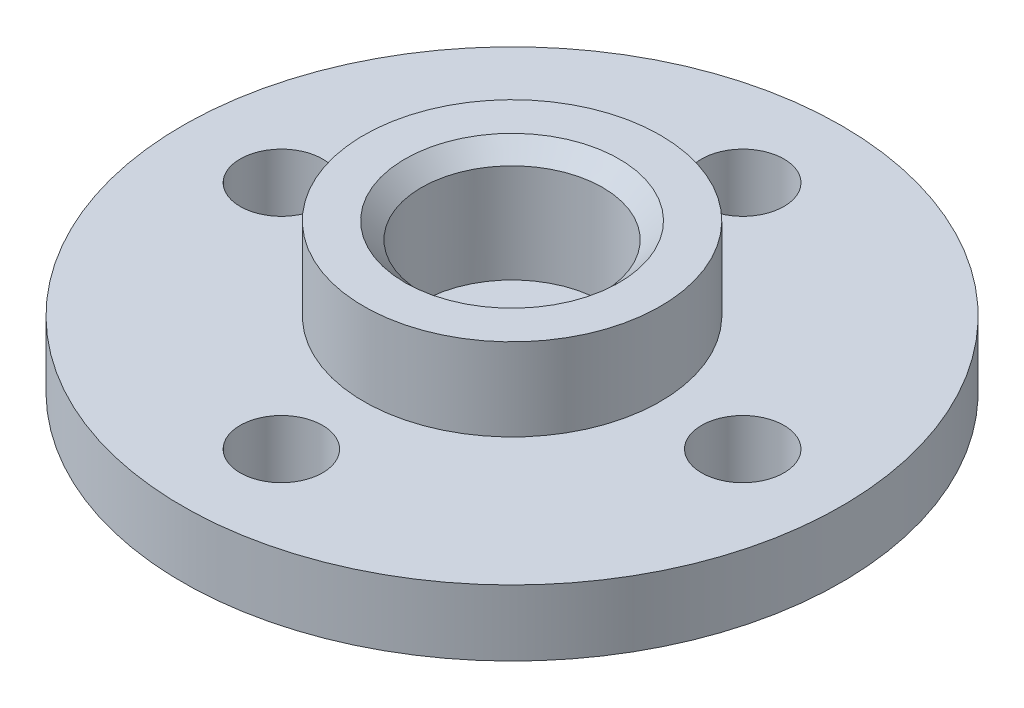
ISO-10303-21;
HEADER;
FILE_DESCRIPTION(('STEP AP214'),'2;1');
FILE_NAME('part.step','',(''),(''),'','','');
FILE_SCHEMA(('AUTOMOTIVE_DESIGN { 1 0 10303 214 1 1 1 1 }'));
ENDSEC;
DATA;
#1=APPLICATION_CONTEXT('core data for automotive mechanical design processes');
#2=APPLICATION_PROTOCOL_DEFINITION('international standard','automotive_design',2000,#1);
#3=PRODUCT_CONTEXT('',#1,'mechanical');
#4=PRODUCT('Part','Part','',(#3));
#5=PRODUCT_RELATED_PRODUCT_CATEGORY('part','',(#4));
#6=PRODUCT_DEFINITION_FORMATION('','',#4);
#7=PRODUCT_DEFINITION_CONTEXT('part definition',#1,'design');
#8=PRODUCT_DEFINITION('design','',#6,#7);
#9=PRODUCT_DEFINITION_SHAPE('','',#8);
#10=(LENGTH_UNIT() NAMED_UNIT(*) SI_UNIT(.MILLI.,.METRE.));
#11=(NAMED_UNIT(*) PLANE_ANGLE_UNIT() SI_UNIT($,.RADIAN.));
#12=(NAMED_UNIT(*) SI_UNIT($,.STERADIAN.) SOLID_ANGLE_UNIT());
#13=UNCERTAINTY_MEASURE_WITH_UNIT(LENGTH_MEASURE(1.E-05),#10,'distance_accuracy_value','');
#14=(GEOMETRIC_REPRESENTATION_CONTEXT(3) GLOBAL_UNCERTAINTY_ASSIGNED_CONTEXT((#13)) GLOBAL_UNIT_ASSIGNED_CONTEXT((#10,
#11,#12)) REPRESENTATION_CONTEXT('',''));
#15=CARTESIAN_POINT('',(0.,0.,0.));
#16=DIRECTION('',(0.,0.,1.));
#17=DIRECTION('',(1.,0.,0.));
#18=AXIS2_PLACEMENT_3D('',#15,#16,#17);
#19=CARTESIAN_POINT('',(0.,0.,0.));
#20=DIRECTION('',(0.,-1.,0.));
#21=DIRECTION('',(0.,0.,-1.));
#22=AXIS2_PLACEMENT_3D('',#19,#20,#21);
#23=CYLINDRICAL_SURFACE('',#22,1.);
#24=CARTESIAN_POINT('',(0.,0.,0.));
#25=DIRECTION('',(0.,-1.,0.));
#26=DIRECTION('',(0.,0.,-1.));
#27=AXIS2_PLACEMENT_3D('',#24,#25,#26);
#28=CIRCLE('',#27,1.);
#29=CARTESIAN_POINT('',(0.,0.,-1.));
#30=VERTEX_POINT('',#29);
#31=EDGE_CURVE('E46',#30,#30,#28,.T.);
#32=ORIENTED_EDGE('',*,*,#31,.T.);
#33=EDGE_LOOP('',(#32));
#34=FACE_BOUND('',#33,.T.);
#35=CARTESIAN_POINT('',(0.,1.,0.));
#36=DIRECTION('',(0.,-1.,0.));
#37=DIRECTION('',(0.,0.,-1.));
#38=AXIS2_PLACEMENT_3D('',#35,#36,#37);
#39=CIRCLE('',#38,1.);
#40=CARTESIAN_POINT('',(0.,1.,-1.));
#41=VERTEX_POINT('',#40);
#42=EDGE_CURVE('E67',#41,#41,#39,.T.);
#43=ORIENTED_EDGE('',*,*,#42,.F.);
#44=EDGE_LOOP('',(#43));
#45=FACE_BOUND('',#44,.T.);
#46=ADVANCED_FACE('F34',(#34,#45),#23,.F.);
#47=CARTESIAN_POINT('',(0.,0.,-2.75));
#48=DIRECTION('',(0.,-1.,0.));
#49=DIRECTION('',(0.,0.,-1.));
#50=AXIS2_PLACEMENT_3D('',#47,#48,#49);
#51=PLANE('',#50);
#52=CARTESIAN_POINT('',(0.,0.,-7.));
#53=DIRECTION('',(0.,1.,0.));
#54=DIRECTION('',(0.,0.,1.));
#55=AXIS2_PLACEMENT_3D('',#52,#53,#54);
#56=CIRCLE('',#55,1.25);
#57=CARTESIAN_POINT('',(0.,0.,-5.75));
#58=VERTEX_POINT('',#57);
#59=EDGE_CURVE('E88',#58,#58,#56,.T.);
#60=ORIENTED_EDGE('',*,*,#59,.T.);
#61=EDGE_LOOP('',(#60));
#62=FACE_BOUND('',#61,.T.);
#63=CARTESIAN_POINT('',(-7.,0.,0.));
#64=DIRECTION('',(0.,1.,0.));
#65=DIRECTION('',(0.,0.,1.));
#66=AXIS2_PLACEMENT_3D('',#63,#64,#65);
#67=CIRCLE('',#66,1.25);
#68=CARTESIAN_POINT('',(-7.,0.,1.25));
#69=VERTEX_POINT('',#68);
#70=EDGE_CURVE('E82',#69,#69,#67,.T.);
#71=ORIENTED_EDGE('',*,*,#70,.T.);
#72=EDGE_LOOP('',(#71));
#73=FACE_BOUND('',#72,.T.);
#74=CARTESIAN_POINT('',(7.,0.,0.));
#75=DIRECTION('',(0.,1.,0.));
#76=DIRECTION('',(0.,0.,1.));
#77=AXIS2_PLACEMENT_3D('',#74,#75,#76);
#78=CIRCLE('',#77,1.25);
#79=CARTESIAN_POINT('',(7.,0.,1.25));
#80=VERTEX_POINT('',#79);
#81=EDGE_CURVE('E76',#80,#80,#78,.T.);
#82=ORIENTED_EDGE('',*,*,#81,.T.);
#83=EDGE_LOOP('',(#82));
#84=FACE_BOUND('',#83,.T.);
#85=CARTESIAN_POINT('',(0.,0.,7.));
#86=DIRECTION('',(0.,1.,0.));
#87=DIRECTION('',(0.,0.,1.));
#88=AXIS2_PLACEMENT_3D('',#85,#86,#87);
#89=CIRCLE('',#88,1.25);
#90=CARTESIAN_POINT('',(0.,0.,8.25));
#91=VERTEX_POINT('',#90);
#92=EDGE_CURVE('E70',#91,#91,#89,.T.);
#93=ORIENTED_EDGE('',*,*,#92,.T.);
#94=EDGE_LOOP('',(#93));
#95=FACE_BOUND('',#94,.T.);
#96=CARTESIAN_POINT('',(0.,0.,0.));
#97=DIRECTION('',(0.,-1.,0.));
#98=DIRECTION('',(0.,0.,-1.));
#99=AXIS2_PLACEMENT_3D('',#96,#97,#98);
#100=CIRCLE('',#99,10.);
#101=CARTESIAN_POINT('',(0.,0.,-10.));
#102=VERTEX_POINT('',#101);
#103=EDGE_CURVE('E50',#102,#102,#100,.T.);
#104=ORIENTED_EDGE('',*,*,#103,.T.);
#105=EDGE_LOOP('',(#104));
#106=FACE_BOUND('',#105,.T.);
#107=ORIENTED_EDGE('',*,*,#31,.F.);
#108=EDGE_LOOP('',(#107));
#109=FACE_BOUND('',#108,.T.);
#110=ADVANCED_FACE('F115',(#62,#73,#84,#95,#106,#109),#51,.T.);
#111=CARTESIAN_POINT('',(0.,0.,0.));
#112=DIRECTION('',(0.,-1.,0.));
#113=DIRECTION('',(0.,0.,-1.));
#114=AXIS2_PLACEMENT_3D('',#111,#112,#113);
#115=CYLINDRICAL_SURFACE('',#114,10.);
#116=CARTESIAN_POINT('',(0.,2.,0.));
#117=DIRECTION('',(0.,-1.,0.));
#118=DIRECTION('',(0.,0.,-1.));
#119=AXIS2_PLACEMENT_3D('',#116,#117,#118);
#120=CIRCLE('',#119,10.);
#121=CARTESIAN_POINT('',(0.,2.,-10.));
#122=VERTEX_POINT('',#121);
#123=EDGE_CURVE('E55',#122,#122,#120,.T.);
#124=ORIENTED_EDGE('',*,*,#123,.T.);
#125=EDGE_LOOP('',(#124));
#126=FACE_BOUND('',#125,.T.);
#127=ORIENTED_EDGE('',*,*,#103,.F.);
#128=EDGE_LOOP('',(#127));
#129=FACE_BOUND('',#128,.T.);
#130=ADVANCED_FACE('F101',(#126,#129),#115,.T.);
#131=CARTESIAN_POINT('',(0.,2.,-10.));
#132=DIRECTION('',(0.,1.,0.));
#133=DIRECTION('',(0.,0.,1.));
#134=AXIS2_PLACEMENT_3D('',#131,#132,#133);
#135=PLANE('',#134);
#136=CARTESIAN_POINT('',(0.,2.,-7.));
#137=DIRECTION('',(0.,1.,0.));
#138=DIRECTION('',(0.,0.,1.));
#139=AXIS2_PLACEMENT_3D('',#136,#137,#138);
#140=CIRCLE('',#139,1.25);
#141=CARTESIAN_POINT('',(0.,2.,-5.75));
#142=VERTEX_POINT('',#141);
#143=EDGE_CURVE('E91',#142,#142,#140,.T.);
#144=ORIENTED_EDGE('',*,*,#143,.F.);
#145=EDGE_LOOP('',(#144));
#146=FACE_BOUND('',#145,.T.);
#147=CARTESIAN_POINT('',(-7.,2.,0.));
#148=DIRECTION('',(0.,1.,0.));
#149=DIRECTION('',(0.,0.,1.));
#150=AXIS2_PLACEMENT_3D('',#147,#148,#149);
#151=CIRCLE('',#150,1.25);
#152=CARTESIAN_POINT('',(-7.,2.,1.25));
#153=VERTEX_POINT('',#152);
#154=EDGE_CURVE('E85',#153,#153,#151,.T.);
#155=ORIENTED_EDGE('',*,*,#154,.F.);
#156=EDGE_LOOP('',(#155));
#157=FACE_BOUND('',#156,.T.);
#158=CARTESIAN_POINT('',(7.,2.,0.));
#159=DIRECTION('',(0.,1.,0.));
#160=DIRECTION('',(0.,0.,1.));
#161=AXIS2_PLACEMENT_3D('',#158,#159,#160);
#162=CIRCLE('',#161,1.25);
#163=CARTESIAN_POINT('',(7.,2.,1.25));
#164=VERTEX_POINT('',#163);
#165=EDGE_CURVE('E79',#164,#164,#162,.T.);
#166=ORIENTED_EDGE('',*,*,#165,.F.);
#167=EDGE_LOOP('',(#166));
#168=FACE_BOUND('',#167,.T.);
#169=CARTESIAN_POINT('',(0.,2.,7.));
#170=DIRECTION('',(0.,1.,0.));
#171=DIRECTION('',(0.,0.,1.));
#172=AXIS2_PLACEMENT_3D('',#169,#170,#171);
#173=CIRCLE('',#172,1.25);
#174=CARTESIAN_POINT('',(0.,2.,8.25));
#175=VERTEX_POINT('',#174);
#176=EDGE_CURVE('E73',#175,#175,#173,.T.);
#177=ORIENTED_EDGE('',*,*,#176,.F.);
#178=EDGE_LOOP('',(#177));
#179=FACE_BOUND('',#178,.T.);
#180=CARTESIAN_POINT('',(0.,2.,0.));
#181=DIRECTION('',(0.,-1.,0.));
#182=DIRECTION('',(0.,0.,-1.));
#183=AXIS2_PLACEMENT_3D('',#180,#181,#182);
#184=CIRCLE('',#183,4.5);
#185=CARTESIAN_POINT('',(0.,2.,-4.5));
#186=VERTEX_POINT('',#185);
#187=EDGE_CURVE('E58',#186,#186,#184,.T.);
#188=ORIENTED_EDGE('',*,*,#187,.T.);
#189=EDGE_LOOP('',(#188));
#190=FACE_BOUND('',#189,.T.);
#191=ORIENTED_EDGE('',*,*,#123,.F.);
#192=EDGE_LOOP('',(#191));
#193=FACE_BOUND('',#192,.T.);
#194=ADVANCED_FACE('F97',(#146,#157,#168,#179,#190,#193),#135,.T.);
#195=CARTESIAN_POINT('',(0.,0.,0.));
#196=DIRECTION('',(0.,-1.,0.));
#197=DIRECTION('',(0.,0.,-1.));
#198=AXIS2_PLACEMENT_3D('',#195,#196,#197);
#199=CYLINDRICAL_SURFACE('',#198,4.5);
#200=CARTESIAN_POINT('',(0.,4.5,0.));
#201=DIRECTION('',(0.,-1.,0.));
#202=DIRECTION('',(0.,0.,-1.));
#203=AXIS2_PLACEMENT_3D('',#200,#201,#202);
#204=CIRCLE('',#203,4.5);
#205=CARTESIAN_POINT('',(0.,4.5,-4.5));
#206=VERTEX_POINT('',#205);
#207=EDGE_CURVE('E61',#206,#206,#204,.T.);
#208=ORIENTED_EDGE('',*,*,#207,.T.);
#209=EDGE_LOOP('',(#208));
#210=FACE_BOUND('',#209,.T.);
#211=ORIENTED_EDGE('',*,*,#187,.F.);
#212=EDGE_LOOP('',(#211));
#213=FACE_BOUND('',#212,.T.);
#214=ADVANCED_FACE('F100',(#210,#213),#199,.T.);
#215=CARTESIAN_POINT('',(0.,4.5,-4.5));
#216=DIRECTION('',(0.,1.,0.));
#217=DIRECTION('',(0.,0.,1.));
#218=AXIS2_PLACEMENT_3D('',#215,#216,#217);
#219=PLANE('',#218);
#220=CARTESIAN_POINT('',(0.,4.5,0.));
#221=DIRECTION('',(0.,1.,0.));
#222=DIRECTION('',(0.,0.,1.));
#223=AXIS2_PLACEMENT_3D('',#220,#221,#222);
#224=CIRCLE('',#223,3.25);
#225=CARTESIAN_POINT('',(0.,4.5,3.25));
#226=VERTEX_POINT('',#225);
#227=EDGE_CURVE('E42',#226,#226,#224,.F.);
#228=ORIENTED_EDGE('',*,*,#227,.T.);
#229=EDGE_LOOP('',(#228));
#230=FACE_BOUND('',#229,.T.);
#231=ORIENTED_EDGE('',*,*,#207,.F.);
#232=EDGE_LOOP('',(#231));
#233=FACE_BOUND('',#232,.T.);
#234=ADVANCED_FACE('F138',(#230,#233),#219,.T.);
#235=CARTESIAN_POINT('',(0.,0.,0.));
#236=DIRECTION('',(0.,-1.,0.));
#237=DIRECTION('',(0.,0.,-1.));
#238=AXIS2_PLACEMENT_3D('',#235,#236,#237);
#239=CYLINDRICAL_SURFACE('',#238,2.75);
#240=CARTESIAN_POINT('',(0.,4.,0.));
#241=DIRECTION('',(0.,1.,0.));
#242=DIRECTION('',(0.,0.,1.));
#243=AXIS2_PLACEMENT_3D('',#240,#241,#242);
#244=CIRCLE('',#243,2.75);
#245=CARTESIAN_POINT('',(0.,4.,2.75));
#246=VERTEX_POINT('',#245);
#247=EDGE_CURVE('E10',#246,#246,#244,.T.);
#248=ORIENTED_EDGE('',*,*,#247,.T.);
#249=EDGE_LOOP('',(#248));
#250=FACE_BOUND('',#249,.T.);
#251=CARTESIAN_POINT('',(0.,1.,0.));
#252=DIRECTION('',(0.,-1.,0.));
#253=DIRECTION('',(0.,0.,-1.));
#254=AXIS2_PLACEMENT_3D('',#251,#252,#253);
#255=CIRCLE('',#254,2.75);
#256=CARTESIAN_POINT('',(0.,1.,-2.75));
#257=VERTEX_POINT('',#256);
#258=EDGE_CURVE('E64',#257,#257,#255,.T.);
#259=ORIENTED_EDGE('',*,*,#258,.T.);
#260=EDGE_LOOP('',(#259));
#261=FACE_BOUND('',#260,.T.);
#262=ADVANCED_FACE('F133',(#250,#261),#239,.F.);
#263=CARTESIAN_POINT('',(0.,1.,-2.75));
#264=DIRECTION('',(0.,1.,0.));
#265=DIRECTION('',(0.,0.,1.));
#266=AXIS2_PLACEMENT_3D('',#263,#264,#265);
#267=PLANE('',#266);
#268=ORIENTED_EDGE('',*,*,#42,.T.);
#269=EDGE_LOOP('',(#268));
#270=FACE_BOUND('',#269,.T.);
#271=ORIENTED_EDGE('',*,*,#258,.F.);
#272=EDGE_LOOP('',(#271));
#273=FACE_BOUND('',#272,.T.);
#274=ADVANCED_FACE('F129',(#270,#273),#267,.T.);
#275=CARTESIAN_POINT('',(0.,2.,7.));
#276=DIRECTION('',(0.,1.,0.));
#277=DIRECTION('',(0.,0.,1.));
#278=AXIS2_PLACEMENT_3D('',#275,#276,#277);
#279=CYLINDRICAL_SURFACE('',#278,1.25);
#280=ORIENTED_EDGE('',*,*,#92,.F.);
#281=EDGE_LOOP('',(#280));
#282=FACE_BOUND('',#281,.T.);
#283=ORIENTED_EDGE('',*,*,#176,.T.);
#284=EDGE_LOOP('',(#283));
#285=FACE_BOUND('',#284,.T.);
#286=ADVANCED_FACE('F132',(#282,#285),#279,.F.);
#287=CARTESIAN_POINT('',(7.,2.,0.));
#288=DIRECTION('',(0.,1.,0.));
#289=DIRECTION('',(0.,0.,1.));
#290=AXIS2_PLACEMENT_3D('',#287,#288,#289);
#291=CYLINDRICAL_SURFACE('',#290,1.25);
#292=ORIENTED_EDGE('',*,*,#81,.F.);
#293=EDGE_LOOP('',(#292));
#294=FACE_BOUND('',#293,.T.);
#295=ORIENTED_EDGE('',*,*,#165,.T.);
#296=EDGE_LOOP('',(#295));
#297=FACE_BOUND('',#296,.T.);
#298=ADVANCED_FACE('F190',(#294,#297),#291,.F.);
#299=CARTESIAN_POINT('',(-7.,2.,0.));
#300=DIRECTION('',(0.,1.,0.));
#301=DIRECTION('',(0.,0.,1.));
#302=AXIS2_PLACEMENT_3D('',#299,#300,#301);
#303=CYLINDRICAL_SURFACE('',#302,1.25);
#304=ORIENTED_EDGE('',*,*,#70,.F.);
#305=EDGE_LOOP('',(#304));
#306=FACE_BOUND('',#305,.T.);
#307=ORIENTED_EDGE('',*,*,#154,.T.);
#308=EDGE_LOOP('',(#307));
#309=FACE_BOUND('',#308,.T.);
#310=ADVANCED_FACE('F185',(#306,#309),#303,.F.);
#311=CARTESIAN_POINT('',(0.,2.,-7.));
#312=DIRECTION('',(0.,1.,0.));
#313=DIRECTION('',(0.,0.,1.));
#314=AXIS2_PLACEMENT_3D('',#311,#312,#313);
#315=CYLINDRICAL_SURFACE('',#314,1.25);
#316=ORIENTED_EDGE('',*,*,#59,.F.);
#317=EDGE_LOOP('',(#316));
#318=FACE_BOUND('',#317,.T.);
#319=ORIENTED_EDGE('',*,*,#143,.T.);
#320=EDGE_LOOP('',(#319));
#321=FACE_BOUND('',#320,.T.);
#322=ADVANCED_FACE('F95',(#318,#321),#315,.F.);
#323=CARTESIAN_POINT('',(0.,4.5,0.));
#324=DIRECTION('',(0.,1.,0.));
#325=DIRECTION('',(0.,0.,1.));
#326=AXIS2_PLACEMENT_3D('',#323,#324,#325);
#327=CONICAL_SURFACE('',#326,3.25,0.785398163397444);
#328=ORIENTED_EDGE('',*,*,#247,.F.);
#329=EDGE_LOOP('',(#328));
#330=FACE_BOUND('',#329,.T.);
#331=ORIENTED_EDGE('',*,*,#227,.F.);
#332=EDGE_LOOP('',(#331));
#333=FACE_BOUND('',#332,.T.);
#334=ADVANCED_FACE('F37',(#330,#333),#327,.F.);
#335=CLOSED_SHELL('',(#46,#110,#130,#194,#214,#234,#262,#274,#286,#298,#310,#322,#334));
#336=MANIFOLD_SOLID_BREP('B2',#335);
#337=ADVANCED_BREP_SHAPE_REPRESENTATION('',(#18,#336),#14);
#338=SHAPE_DEFINITION_REPRESENTATION(#9,#337);
ENDSEC;
END-ISO-10303-21;
